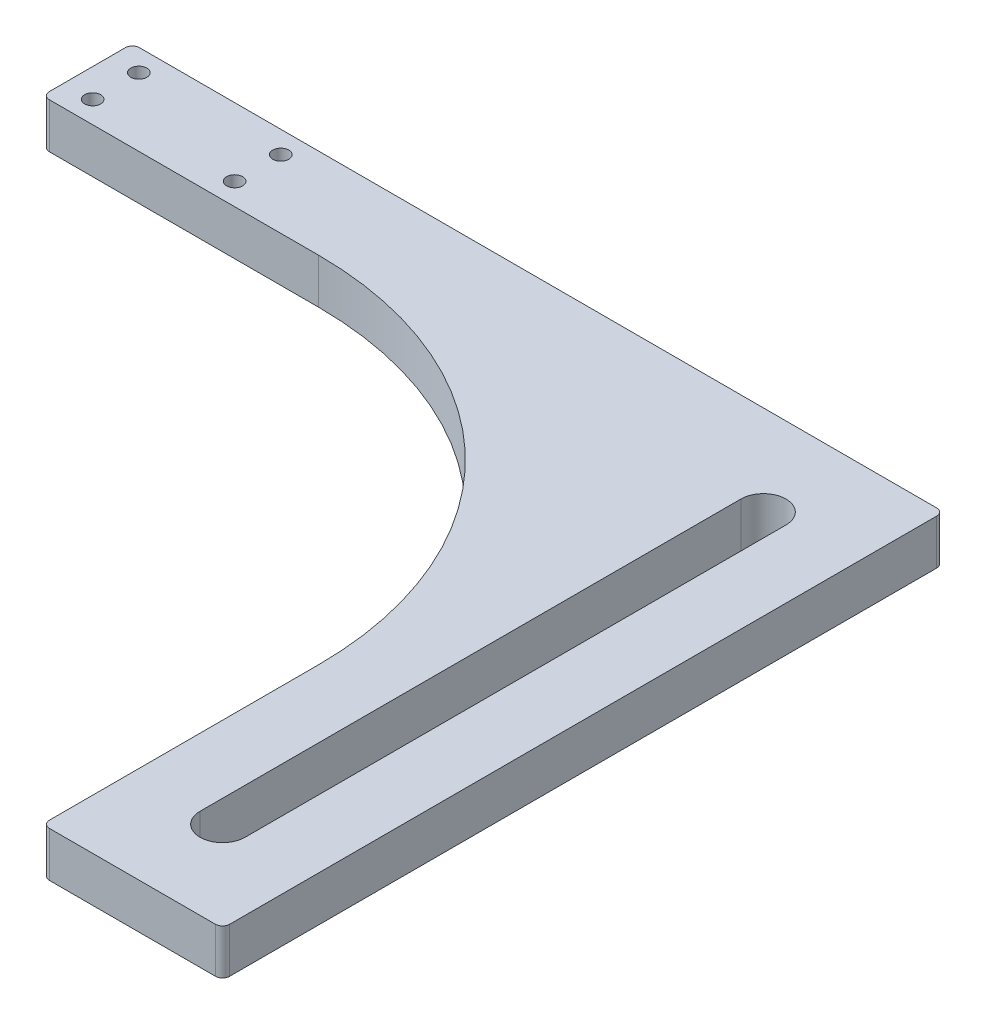
ISO-10303-21;
HEADER;
FILE_DESCRIPTION(('STEP AP214'),'2;1');
FILE_NAME('part.step','',(''),(''),'','','');
FILE_SCHEMA(('AUTOMOTIVE_DESIGN { 1 0 10303 214 1 1 1 1 }'));
ENDSEC;
DATA;
#1=APPLICATION_CONTEXT('core data for automotive mechanical design processes');
#2=APPLICATION_PROTOCOL_DEFINITION('international standard','automotive_design',2000,#1);
#3=PRODUCT_CONTEXT('',#1,'mechanical');
#4=PRODUCT('Part','Part','',(#3));
#5=PRODUCT_RELATED_PRODUCT_CATEGORY('part','',(#4));
#6=PRODUCT_DEFINITION_FORMATION('','',#4);
#7=PRODUCT_DEFINITION_CONTEXT('part definition',#1,'design');
#8=PRODUCT_DEFINITION('design','',#6,#7);
#9=PRODUCT_DEFINITION_SHAPE('','',#8);
#10=(LENGTH_UNIT() NAMED_UNIT(*) SI_UNIT(.MILLI.,.METRE.));
#11=(NAMED_UNIT(*) PLANE_ANGLE_UNIT() SI_UNIT($,.RADIAN.));
#12=(NAMED_UNIT(*) SI_UNIT($,.STERADIAN.) SOLID_ANGLE_UNIT());
#13=UNCERTAINTY_MEASURE_WITH_UNIT(LENGTH_MEASURE(1.E-05),#10,'distance_accuracy_value','');
#14=(GEOMETRIC_REPRESENTATION_CONTEXT(3) GLOBAL_UNCERTAINTY_ASSIGNED_CONTEXT((#13)) GLOBAL_UNIT_ASSIGNED_CONTEXT((#10,
#11,#12)) REPRESENTATION_CONTEXT('',''));
#15=CARTESIAN_POINT('',(0.,0.,0.));
#16=DIRECTION('',(0.,0.,1.));
#17=DIRECTION('',(1.,0.,0.));
#18=AXIS2_PLACEMENT_3D('',#15,#16,#17);
#19=CARTESIAN_POINT('',(-62.7,6.35,11.9));
#20=DIRECTION('',(0.,-1.,0.));
#21=DIRECTION('',(0.,0.,-1.));
#22=AXIS2_PLACEMENT_3D('',#19,#20,#21);
#23=PLANE('',#22);
#24=DIRECTION('',(-1.,0.,0.));
#25=VECTOR('',#24,1.);
#26=CARTESIAN_POINT('',(-12.7,6.35,-50.8));
#27=LINE('',#26,#25);
#28=CARTESIAN_POINT('',(11.7,6.35,-50.8));
#29=VERTEX_POINT('',#28);
#30=CARTESIAN_POINT('',(-100.6,6.35,-50.8));
#31=VERTEX_POINT('',#30);
#32=EDGE_CURVE('E196',#29,#31,#27,.T.);
#33=ORIENTED_EDGE('',*,*,#32,.T.);
#34=CARTESIAN_POINT('',(-100.6,6.35,-49.8));
#35=DIRECTION('',(0.,-1.,0.));
#36=DIRECTION('',(0.,0.,-1.));
#37=AXIS2_PLACEMENT_3D('',#34,#35,#36);
#38=CIRCLE('',#37,1.);
#39=CARTESIAN_POINT('',(-101.6,6.35,-49.8));
#40=VERTEX_POINT('',#39);
#41=EDGE_CURVE('E260',#31,#40,#38,.F.);
#42=ORIENTED_EDGE('',*,*,#41,.T.);
#43=DIRECTION('',(0.,0.,1.));
#44=VECTOR('',#43,1.);
#45=CARTESIAN_POINT('',(-101.6,6.35,-50.8));
#46=LINE('',#45,#44);
#47=CARTESIAN_POINT('',(-101.6,6.35,-39.1));
#48=VERTEX_POINT('',#47);
#49=EDGE_CURVE('E200',#40,#48,#46,.T.);
#50=ORIENTED_EDGE('',*,*,#49,.T.);
#51=CARTESIAN_POINT('',(-100.6,6.35,-39.1));
#52=DIRECTION('',(0.,-1.,0.));
#53=DIRECTION('',(0.,0.,-1.));
#54=AXIS2_PLACEMENT_3D('',#51,#52,#53);
#55=CIRCLE('',#54,1.);
#56=CARTESIAN_POINT('',(-100.6,6.35,-38.1));
#57=VERTEX_POINT('',#56);
#58=EDGE_CURVE('E258',#48,#57,#55,.F.);
#59=ORIENTED_EDGE('',*,*,#58,.T.);
#60=DIRECTION('',(1.,0.,0.));
#61=VECTOR('',#60,1.);
#62=CARTESIAN_POINT('',(-101.6,6.35,-38.1));
#63=LINE('',#62,#61);
#64=CARTESIAN_POINT('',(-62.7,6.35,-38.1));
#65=VERTEX_POINT('',#64);
#66=EDGE_CURVE('E203',#57,#65,#63,.T.);
#67=ORIENTED_EDGE('',*,*,#66,.T.);
#68=CARTESIAN_POINT('',(-62.7,6.35,11.9));
#69=DIRECTION('',(0.,-1.,0.));
#70=DIRECTION('',(0.,0.,-1.));
#71=AXIS2_PLACEMENT_3D('',#68,#69,#70);
#72=CIRCLE('',#71,50.);
#73=CARTESIAN_POINT('',(-12.7,6.35,11.9));
#74=VERTEX_POINT('',#73);
#75=EDGE_CURVE('E205',#65,#74,#72,.T.);
#76=ORIENTED_EDGE('',*,*,#75,.T.);
#77=DIRECTION('',(0.,0.,1.));
#78=VECTOR('',#77,1.);
#79=CARTESIAN_POINT('',(-12.7,6.35,11.9));
#80=LINE('',#79,#78);
#81=CARTESIAN_POINT('',(-12.7,6.35,49.8));
#82=VERTEX_POINT('',#81);
#83=EDGE_CURVE('E207',#74,#82,#80,.T.);
#84=ORIENTED_EDGE('',*,*,#83,.T.);
#85=CARTESIAN_POINT('',(-11.7,6.35,49.8));
#86=DIRECTION('',(0.,-1.,0.));
#87=DIRECTION('',(0.,0.,-1.));
#88=AXIS2_PLACEMENT_3D('',#85,#86,#87);
#89=CIRCLE('',#88,1.);
#90=CARTESIAN_POINT('',(-11.7,6.35,50.8));
#91=VERTEX_POINT('',#90);
#92=EDGE_CURVE('E55',#82,#91,#89,.F.);
#93=ORIENTED_EDGE('',*,*,#92,.T.);
#94=DIRECTION('',(1.,0.,0.));
#95=VECTOR('',#94,1.);
#96=CARTESIAN_POINT('',(-12.7,6.35,50.8));
#97=LINE('',#96,#95);
#98=CARTESIAN_POINT('',(11.7,6.35,50.8));
#99=VERTEX_POINT('',#98);
#100=EDGE_CURVE('E209',#91,#99,#97,.T.);
#101=ORIENTED_EDGE('',*,*,#100,.T.);
#102=CARTESIAN_POINT('',(11.7,6.35,49.8));
#103=DIRECTION('',(0.,-1.,0.));
#104=DIRECTION('',(0.,0.,-1.));
#105=AXIS2_PLACEMENT_3D('',#102,#103,#104);
#106=CIRCLE('',#105,1.);
#107=CARTESIAN_POINT('',(12.7,6.35,49.8));
#108=VERTEX_POINT('',#107);
#109=EDGE_CURVE('E255',#99,#108,#106,.F.);
#110=ORIENTED_EDGE('',*,*,#109,.T.);
#111=DIRECTION('',(0.,0.,-1.));
#112=VECTOR('',#111,1.);
#113=CARTESIAN_POINT('',(12.7,6.35,50.8));
#114=LINE('',#113,#112);
#115=CARTESIAN_POINT('',(12.7,6.35,-49.8));
#116=VERTEX_POINT('',#115);
#117=EDGE_CURVE('E193',#108,#116,#114,.T.);
#118=ORIENTED_EDGE('',*,*,#117,.T.);
#119=CARTESIAN_POINT('',(11.7,6.35,-49.8));
#120=DIRECTION('',(0.,-1.,0.));
#121=DIRECTION('',(0.,0.,-1.));
#122=AXIS2_PLACEMENT_3D('',#119,#120,#121);
#123=CIRCLE('',#122,1.);
#124=EDGE_CURVE('E253',#116,#29,#123,.F.);
#125=ORIENTED_EDGE('',*,*,#124,.T.);
#126=EDGE_LOOP('',(#33,#42,#50,#59,#67,#76,#84,#93,#101,#110,#118,#125));
#127=FACE_BOUND('',#126,.T.);
#128=CARTESIAN_POINT('',(0.,6.35,38.1));
#129=DIRECTION('',(0.,1.,0.));
#130=DIRECTION('',(0.,0.,1.));
#131=AXIS2_PLACEMENT_3D('',#128,#129,#130);
#132=CIRCLE('',#131,3.175);
#133=CARTESIAN_POINT('',(-3.175,6.35,38.1));
#134=VERTEX_POINT('',#133);
#135=CARTESIAN_POINT('',(3.175,6.35,38.1));
#136=VERTEX_POINT('',#135);
#137=EDGE_CURVE('E149',#134,#136,#132,.T.);
#138=ORIENTED_EDGE('',*,*,#137,.F.);
#139=DIRECTION('',(0.,0.,1.));
#140=VECTOR('',#139,1.);
#141=CARTESIAN_POINT('',(-3.175,6.35,38.1));
#142=LINE('',#141,#140);
#143=CARTESIAN_POINT('',(-3.175,6.35,-38.1));
#144=VERTEX_POINT('',#143);
#145=EDGE_CURVE('E175',#144,#134,#142,.T.);
#146=ORIENTED_EDGE('',*,*,#145,.F.);
#147=CARTESIAN_POINT('',(0.,6.35,-38.1));
#148=DIRECTION('',(0.,1.,0.));
#149=DIRECTION('',(0.,0.,1.));
#150=AXIS2_PLACEMENT_3D('',#147,#148,#149);
#151=CIRCLE('',#150,3.175);
#152=CARTESIAN_POINT('',(3.175,6.35,-38.1));
#153=VERTEX_POINT('',#152);
#154=EDGE_CURVE('E173',#153,#144,#151,.T.);
#155=ORIENTED_EDGE('',*,*,#154,.F.);
#156=DIRECTION('',(0.,0.,-1.));
#157=VECTOR('',#156,1.);
#158=CARTESIAN_POINT('',(3.175,6.35,38.1));
#159=LINE('',#158,#157);
#160=EDGE_CURVE('E159',#136,#153,#159,.T.);
#161=ORIENTED_EDGE('',*,*,#160,.F.);
#162=EDGE_LOOP('',(#138,#146,#155,#161));
#163=FACE_BOUND('',#162,.T.);
#164=CARTESIAN_POINT('',(-97.6,6.35,-47.7));
#165=DIRECTION('',(0.,1.,0.));
#166=DIRECTION('',(0.,0.,1.));
#167=AXIS2_PLACEMENT_3D('',#164,#165,#166);
#168=CIRCLE('',#167,1.1303);
#169=CARTESIAN_POINT('',(-97.6,6.35,-46.5697));
#170=VERTEX_POINT('',#169);
#171=EDGE_CURVE('E182',#170,#170,#168,.T.);
#172=ORIENTED_EDGE('',*,*,#171,.F.);
#173=EDGE_LOOP('',(#172));
#174=FACE_BOUND('',#173,.T.);
#175=CARTESIAN_POINT('',(-97.6,6.35,-41.2));
#176=DIRECTION('',(0.,1.,0.));
#177=DIRECTION('',(0.,0.,1.));
#178=AXIS2_PLACEMENT_3D('',#175,#176,#177);
#179=CIRCLE('',#178,1.1303);
#180=CARTESIAN_POINT('',(-97.6,6.35,-40.0697));
#181=VERTEX_POINT('',#180);
#182=EDGE_CURVE('E535',#181,#181,#179,.T.);
#183=ORIENTED_EDGE('',*,*,#182,.F.);
#184=EDGE_LOOP('',(#183));
#185=FACE_BOUND('',#184,.T.);
#186=CARTESIAN_POINT('',(-77.6,6.35,-47.7));
#187=DIRECTION('',(0.,1.,0.));
#188=DIRECTION('',(0.,0.,1.));
#189=AXIS2_PLACEMENT_3D('',#186,#187,#188);
#190=CIRCLE('',#189,1.1303);
#191=CARTESIAN_POINT('',(-77.6,6.35,-46.5697));
#192=VERTEX_POINT('',#191);
#193=EDGE_CURVE('E530',#192,#192,#190,.T.);
#194=ORIENTED_EDGE('',*,*,#193,.F.);
#195=EDGE_LOOP('',(#194));
#196=FACE_BOUND('',#195,.T.);
#197=CARTESIAN_POINT('',(-77.6,6.35,-41.2));
#198=DIRECTION('',(0.,1.,0.));
#199=DIRECTION('',(0.,0.,1.));
#200=AXIS2_PLACEMENT_3D('',#197,#198,#199);
#201=CIRCLE('',#200,1.1303);
#202=CARTESIAN_POINT('',(-77.6,6.35,-40.0697));
#203=VERTEX_POINT('',#202);
#204=EDGE_CURVE('E524',#203,#203,#201,.T.);
#205=ORIENTED_EDGE('',*,*,#204,.F.);
#206=EDGE_LOOP('',(#205));
#207=FACE_BOUND('',#206,.T.);
#208=ADVANCED_FACE('F33',(#127,#163,#174,#185,#196,#207),#23,.F.);
#209=CARTESIAN_POINT('',(-62.7,0.,11.9));
#210=DIRECTION('',(0.,-1.,0.));
#211=DIRECTION('',(0.,0.,-1.));
#212=AXIS2_PLACEMENT_3D('',#209,#210,#211);
#213=PLANE('',#212);
#214=CARTESIAN_POINT('',(-77.6,0.,-47.7));
#215=DIRECTION('',(0.,1.,0.));
#216=DIRECTION('',(0.,0.,1.));
#217=AXIS2_PLACEMENT_3D('',#214,#215,#216);
#218=CIRCLE('',#217,1.1303);
#219=CARTESIAN_POINT('',(-77.6,0.,-46.5697));
#220=VERTEX_POINT('',#219);
#221=EDGE_CURVE('E527',#220,#220,#218,.T.);
#222=ORIENTED_EDGE('',*,*,#221,.T.);
#223=EDGE_LOOP('',(#222));
#224=FACE_BOUND('',#223,.T.);
#225=CARTESIAN_POINT('',(-97.6,0.,-47.7));
#226=DIRECTION('',(0.,1.,0.));
#227=DIRECTION('',(0.,0.,1.));
#228=AXIS2_PLACEMENT_3D('',#225,#226,#227);
#229=CIRCLE('',#228,1.1303);
#230=CARTESIAN_POINT('',(-97.6,0.,-46.5697));
#231=VERTEX_POINT('',#230);
#232=EDGE_CURVE('E538',#231,#231,#229,.T.);
#233=ORIENTED_EDGE('',*,*,#232,.T.);
#234=EDGE_LOOP('',(#233));
#235=FACE_BOUND('',#234,.T.);
#236=DIRECTION('',(0.,0.,1.));
#237=VECTOR('',#236,1.);
#238=CARTESIAN_POINT('',(-101.6,0.,-50.8));
#239=LINE('',#238,#237);
#240=CARTESIAN_POINT('',(-101.6,0.,-49.8));
#241=VERTEX_POINT('',#240);
#242=CARTESIAN_POINT('',(-101.6,0.,-39.1));
#243=VERTEX_POINT('',#242);
#244=EDGE_CURVE('E217',#241,#243,#239,.T.);
#245=ORIENTED_EDGE('',*,*,#244,.F.);
#246=CARTESIAN_POINT('',(-100.6,0.,-49.8));
#247=DIRECTION('',(0.,-1.,0.));
#248=DIRECTION('',(0.,0.,-1.));
#249=AXIS2_PLACEMENT_3D('',#246,#247,#248);
#250=CIRCLE('',#249,1.);
#251=CARTESIAN_POINT('',(-100.6,0.,-50.8));
#252=VERTEX_POINT('',#251);
#253=EDGE_CURVE('E246',#241,#252,#250,.T.);
#254=ORIENTED_EDGE('',*,*,#253,.T.);
#255=DIRECTION('',(-1.,0.,0.));
#256=VECTOR('',#255,1.);
#257=CARTESIAN_POINT('',(-12.7,0.,-50.8));
#258=LINE('',#257,#256);
#259=CARTESIAN_POINT('',(11.7,0.,-50.8));
#260=VERTEX_POINT('',#259);
#261=EDGE_CURVE('E214',#260,#252,#258,.T.);
#262=ORIENTED_EDGE('',*,*,#261,.F.);
#263=CARTESIAN_POINT('',(11.7,0.,-49.8));
#264=DIRECTION('',(0.,-1.,0.));
#265=DIRECTION('',(0.,0.,-1.));
#266=AXIS2_PLACEMENT_3D('',#263,#264,#265);
#267=CIRCLE('',#266,1.);
#268=CARTESIAN_POINT('',(12.7,0.,-49.8));
#269=VERTEX_POINT('',#268);
#270=EDGE_CURVE('E238',#260,#269,#267,.T.);
#271=ORIENTED_EDGE('',*,*,#270,.T.);
#272=DIRECTION('',(0.,0.,-1.));
#273=VECTOR('',#272,1.);
#274=CARTESIAN_POINT('',(12.7,0.,50.8));
#275=LINE('',#274,#273);
#276=CARTESIAN_POINT('',(12.7,0.,49.8));
#277=VERTEX_POINT('',#276);
#278=EDGE_CURVE('E167',#277,#269,#275,.T.);
#279=ORIENTED_EDGE('',*,*,#278,.F.);
#280=CARTESIAN_POINT('',(11.7,0.,49.8));
#281=DIRECTION('',(0.,-1.,0.));
#282=DIRECTION('',(0.,0.,-1.));
#283=AXIS2_PLACEMENT_3D('',#280,#281,#282);
#284=CIRCLE('',#283,1.);
#285=CARTESIAN_POINT('',(11.7,0.,50.8));
#286=VERTEX_POINT('',#285);
#287=EDGE_CURVE('E240',#277,#286,#284,.T.);
#288=ORIENTED_EDGE('',*,*,#287,.T.);
#289=DIRECTION('',(1.,0.,0.));
#290=VECTOR('',#289,1.);
#291=CARTESIAN_POINT('',(-12.7,0.,50.8));
#292=LINE('',#291,#290);
#293=CARTESIAN_POINT('',(-11.7,0.,50.8));
#294=VERTEX_POINT('',#293);
#295=EDGE_CURVE('E197',#294,#286,#292,.T.);
#296=ORIENTED_EDGE('',*,*,#295,.F.);
#297=CARTESIAN_POINT('',(-11.7,0.,49.8));
#298=DIRECTION('',(0.,-1.,0.));
#299=DIRECTION('',(0.,0.,-1.));
#300=AXIS2_PLACEMENT_3D('',#297,#298,#299);
#301=CIRCLE('',#300,1.);
#302=CARTESIAN_POINT('',(-12.7,0.,49.8));
#303=VERTEX_POINT('',#302);
#304=EDGE_CURVE('E242',#294,#303,#301,.T.);
#305=ORIENTED_EDGE('',*,*,#304,.T.);
#306=DIRECTION('',(0.,0.,1.));
#307=VECTOR('',#306,1.);
#308=CARTESIAN_POINT('',(-12.7,0.,11.9));
#309=LINE('',#308,#307);
#310=CARTESIAN_POINT('',(-12.7,0.,11.9));
#311=VERTEX_POINT('',#310);
#312=EDGE_CURVE('E224',#311,#303,#309,.T.);
#313=ORIENTED_EDGE('',*,*,#312,.F.);
#314=CARTESIAN_POINT('',(-62.7,0.,11.9));
#315=DIRECTION('',(0.,-1.,0.));
#316=DIRECTION('',(0.,0.,-1.));
#317=AXIS2_PLACEMENT_3D('',#314,#315,#316);
#318=CIRCLE('',#317,50.);
#319=CARTESIAN_POINT('',(-62.7,0.,-38.1));
#320=VERTEX_POINT('',#319);
#321=EDGE_CURVE('E222',#320,#311,#318,.T.);
#322=ORIENTED_EDGE('',*,*,#321,.F.);
#323=DIRECTION('',(1.,0.,0.));
#324=VECTOR('',#323,1.);
#325=CARTESIAN_POINT('',(-101.6,0.,-38.1));
#326=LINE('',#325,#324);
#327=CARTESIAN_POINT('',(-100.6,0.,-38.1));
#328=VERTEX_POINT('',#327);
#329=EDGE_CURVE('E220',#328,#320,#326,.T.);
#330=ORIENTED_EDGE('',*,*,#329,.F.);
#331=CARTESIAN_POINT('',(-100.6,0.,-39.1));
#332=DIRECTION('',(0.,-1.,0.));
#333=DIRECTION('',(0.,0.,-1.));
#334=AXIS2_PLACEMENT_3D('',#331,#332,#333);
#335=CIRCLE('',#334,1.);
#336=EDGE_CURVE('E244',#328,#243,#335,.T.);
#337=ORIENTED_EDGE('',*,*,#336,.T.);
#338=EDGE_LOOP('',(#245,#254,#262,#271,#279,#288,#296,#305,#313,#322,#330,#337));
#339=FACE_BOUND('',#338,.T.);
#340=DIRECTION('',(0.,0.,1.));
#341=VECTOR('',#340,1.);
#342=CARTESIAN_POINT('',(-3.175,0.,38.1));
#343=LINE('',#342,#341);
#344=CARTESIAN_POINT('',(-3.175,0.,-38.1));
#345=VERTEX_POINT('',#344);
#346=CARTESIAN_POINT('',(-3.175,0.,38.1));
#347=VERTEX_POINT('',#346);
#348=EDGE_CURVE('E160',#345,#347,#343,.T.);
#349=ORIENTED_EDGE('',*,*,#348,.T.);
#350=CARTESIAN_POINT('',(0.,0.,38.1));
#351=DIRECTION('',(0.,1.,0.));
#352=DIRECTION('',(0.,0.,1.));
#353=AXIS2_PLACEMENT_3D('',#350,#351,#352);
#354=CIRCLE('',#353,3.175);
#355=CARTESIAN_POINT('',(3.175,0.,38.1));
#356=VERTEX_POINT('',#355);
#357=EDGE_CURVE('E180',#347,#356,#354,.T.);
#358=ORIENTED_EDGE('',*,*,#357,.T.);
#359=DIRECTION('',(0.,0.,-1.));
#360=VECTOR('',#359,1.);
#361=CARTESIAN_POINT('',(3.175,0.,38.1));
#362=LINE('',#361,#360);
#363=CARTESIAN_POINT('',(3.175,0.,-38.1));
#364=VERTEX_POINT('',#363);
#365=EDGE_CURVE('E166',#356,#364,#362,.T.);
#366=ORIENTED_EDGE('',*,*,#365,.T.);
#367=CARTESIAN_POINT('',(0.,0.,-38.1));
#368=DIRECTION('',(0.,1.,0.));
#369=DIRECTION('',(0.,0.,1.));
#370=AXIS2_PLACEMENT_3D('',#367,#368,#369);
#371=CIRCLE('',#370,3.175);
#372=EDGE_CURVE('E184',#364,#345,#371,.T.);
#373=ORIENTED_EDGE('',*,*,#372,.T.);
#374=EDGE_LOOP('',(#349,#358,#366,#373));
#375=FACE_BOUND('',#374,.T.);
#376=CARTESIAN_POINT('',(-97.6,0.,-41.2));
#377=DIRECTION('',(0.,1.,0.));
#378=DIRECTION('',(0.,0.,1.));
#379=AXIS2_PLACEMENT_3D('',#376,#377,#378);
#380=CIRCLE('',#379,1.1303);
#381=CARTESIAN_POINT('',(-97.6,0.,-40.0697));
#382=VERTEX_POINT('',#381);
#383=EDGE_CURVE('E519',#382,#382,#380,.T.);
#384=ORIENTED_EDGE('',*,*,#383,.T.);
#385=EDGE_LOOP('',(#384));
#386=FACE_BOUND('',#385,.T.);
#387=CARTESIAN_POINT('',(-77.6,0.,-41.2));
#388=DIRECTION('',(0.,1.,0.));
#389=DIRECTION('',(0.,0.,1.));
#390=AXIS2_PLACEMENT_3D('',#387,#388,#389);
#391=CIRCLE('',#390,1.1303);
#392=CARTESIAN_POINT('',(-77.6,0.,-40.0697));
#393=VERTEX_POINT('',#392);
#394=EDGE_CURVE('E522',#393,#393,#391,.T.);
#395=ORIENTED_EDGE('',*,*,#394,.T.);
#396=EDGE_LOOP('',(#395));
#397=FACE_BOUND('',#396,.T.);
#398=ADVANCED_FACE('F287',(#224,#235,#339,#375,#386,#397),#213,.T.);
#399=CARTESIAN_POINT('',(12.7,6.35,50.8));
#400=DIRECTION('',(-1.,0.,0.));
#401=DIRECTION('',(0.,0.,1.));
#402=AXIS2_PLACEMENT_3D('',#399,#400,#401);
#403=PLANE('',#402);
#404=ORIENTED_EDGE('',*,*,#117,.F.);
#405=DIRECTION('',(0.,-1.,0.));
#406=VECTOR('',#405,1.);
#407=CARTESIAN_POINT('',(12.7,6.35,49.8));
#408=LINE('',#407,#406);
#409=EDGE_CURVE('E11',#108,#277,#408,.T.);
#410=ORIENTED_EDGE('',*,*,#409,.T.);
#411=ORIENTED_EDGE('',*,*,#278,.T.);
#412=DIRECTION('',(0.,-1.,0.));
#413=VECTOR('',#412,1.);
#414=CARTESIAN_POINT('',(12.7,6.35,-49.8));
#415=LINE('',#414,#413);
#416=EDGE_CURVE('E41',#269,#116,#415,.F.);
#417=ORIENTED_EDGE('',*,*,#416,.T.);
#418=EDGE_LOOP('',(#404,#410,#411,#417));
#419=FACE_BOUND('',#418,.T.);
#420=ADVANCED_FACE('F273',(#419),#403,.F.);
#421=CARTESIAN_POINT('',(-12.7,6.35,-50.8));
#422=DIRECTION('',(0.,0.,1.));
#423=DIRECTION('',(1.,0.,0.));
#424=AXIS2_PLACEMENT_3D('',#421,#422,#423);
#425=PLANE('',#424);
#426=ORIENTED_EDGE('',*,*,#261,.T.);
#427=DIRECTION('',(0.,-1.,0.));
#428=VECTOR('',#427,1.);
#429=CARTESIAN_POINT('',(-100.6,6.35,-50.8));
#430=LINE('',#429,#428);
#431=EDGE_CURVE('E251',#252,#31,#430,.F.);
#432=ORIENTED_EDGE('',*,*,#431,.T.);
#433=ORIENTED_EDGE('',*,*,#32,.F.);
#434=DIRECTION('',(0.,-1.,0.));
#435=VECTOR('',#434,1.);
#436=CARTESIAN_POINT('',(11.7,6.35,-50.8));
#437=LINE('',#436,#435);
#438=EDGE_CURVE('E248',#29,#260,#437,.T.);
#439=ORIENTED_EDGE('',*,*,#438,.T.);
#440=EDGE_LOOP('',(#426,#432,#433,#439));
#441=FACE_BOUND('',#440,.T.);
#442=ADVANCED_FACE('F283',(#441),#425,.F.);
#443=CARTESIAN_POINT('',(-101.6,6.35,-50.8));
#444=DIRECTION('',(1.,0.,0.));
#445=DIRECTION('',(0.,0.,-1.));
#446=AXIS2_PLACEMENT_3D('',#443,#444,#445);
#447=PLANE('',#446);
#448=ORIENTED_EDGE('',*,*,#49,.F.);
#449=DIRECTION('',(0.,-1.,0.));
#450=VECTOR('',#449,1.);
#451=CARTESIAN_POINT('',(-101.6,6.35,-49.8));
#452=LINE('',#451,#450);
#453=EDGE_CURVE('E235',#40,#241,#452,.T.);
#454=ORIENTED_EDGE('',*,*,#453,.T.);
#455=ORIENTED_EDGE('',*,*,#244,.T.);
#456=DIRECTION('',(0.,-1.,0.));
#457=VECTOR('',#456,1.);
#458=CARTESIAN_POINT('',(-101.6,6.35,-39.1));
#459=LINE('',#458,#457);
#460=EDGE_CURVE('E233',#243,#48,#459,.F.);
#461=ORIENTED_EDGE('',*,*,#460,.T.);
#462=EDGE_LOOP('',(#448,#454,#455,#461));
#463=FACE_BOUND('',#462,.T.);
#464=ADVANCED_FACE('F295',(#463),#447,.F.);
#465=CARTESIAN_POINT('',(-101.6,6.35,-38.1));
#466=DIRECTION('',(0.,0.,-1.));
#467=DIRECTION('',(-1.,0.,0.));
#468=AXIS2_PLACEMENT_3D('',#465,#466,#467);
#469=PLANE('',#468);
#470=ORIENTED_EDGE('',*,*,#66,.F.);
#471=DIRECTION('',(0.,-1.,0.));
#472=VECTOR('',#471,1.);
#473=CARTESIAN_POINT('',(-100.6,6.35,-38.1));
#474=LINE('',#473,#472);
#475=EDGE_CURVE('E262',#57,#328,#474,.T.);
#476=ORIENTED_EDGE('',*,*,#475,.T.);
#477=ORIENTED_EDGE('',*,*,#329,.T.);
#478=DIRECTION('',(0.,-1.,0.));
#479=VECTOR('',#478,1.);
#480=CARTESIAN_POINT('',(-62.7,6.35,-38.1));
#481=LINE('',#480,#479);
#482=EDGE_CURVE('E230',#65,#320,#481,.T.);
#483=ORIENTED_EDGE('',*,*,#482,.F.);
#484=EDGE_LOOP('',(#470,#476,#477,#483));
#485=FACE_BOUND('',#484,.T.);
#486=ADVANCED_FACE('F304',(#485),#469,.F.);
#487=CARTESIAN_POINT('',(-62.7,6.35,11.9));
#488=DIRECTION('',(0.,-1.,0.));
#489=DIRECTION('',(0.,0.,-1.));
#490=AXIS2_PLACEMENT_3D('',#487,#488,#489);
#491=CYLINDRICAL_SURFACE('',#490,50.);
#492=ORIENTED_EDGE('',*,*,#321,.T.);
#493=DIRECTION('',(0.,-1.,0.));
#494=VECTOR('',#493,1.);
#495=CARTESIAN_POINT('',(-12.7,6.35,11.9));
#496=LINE('',#495,#494);
#497=EDGE_CURVE('E211',#74,#311,#496,.T.);
#498=ORIENTED_EDGE('',*,*,#497,.F.);
#499=ORIENTED_EDGE('',*,*,#75,.F.);
#500=ORIENTED_EDGE('',*,*,#482,.T.);
#501=EDGE_LOOP('',(#492,#498,#499,#500));
#502=FACE_BOUND('',#501,.T.);
#503=ADVANCED_FACE('F310',(#502),#491,.F.);
#504=CARTESIAN_POINT('',(-12.7,6.35,11.9));
#505=DIRECTION('',(1.,0.,0.));
#506=DIRECTION('',(0.,0.,-1.));
#507=AXIS2_PLACEMENT_3D('',#504,#505,#506);
#508=PLANE('',#507);
#509=ORIENTED_EDGE('',*,*,#312,.T.);
#510=DIRECTION('',(0.,-1.,0.));
#511=VECTOR('',#510,1.);
#512=CARTESIAN_POINT('',(-12.7,6.35,49.8));
#513=LINE('',#512,#511);
#514=EDGE_CURVE('E269',#303,#82,#513,.F.);
#515=ORIENTED_EDGE('',*,*,#514,.T.);
#516=ORIENTED_EDGE('',*,*,#83,.F.);
#517=ORIENTED_EDGE('',*,*,#497,.T.);
#518=EDGE_LOOP('',(#509,#515,#516,#517));
#519=FACE_BOUND('',#518,.T.);
#520=ADVANCED_FACE('F314',(#519),#508,.F.);
#521=CARTESIAN_POINT('',(-12.7,6.35,50.8));
#522=DIRECTION('',(0.,0.,-1.));
#523=DIRECTION('',(-1.,0.,0.));
#524=AXIS2_PLACEMENT_3D('',#521,#522,#523);
#525=PLANE('',#524);
#526=ORIENTED_EDGE('',*,*,#100,.F.);
#527=DIRECTION('',(0.,-1.,0.));
#528=VECTOR('',#527,1.);
#529=CARTESIAN_POINT('',(-11.7,6.35,50.8));
#530=LINE('',#529,#528);
#531=EDGE_CURVE('E266',#91,#294,#530,.T.);
#532=ORIENTED_EDGE('',*,*,#531,.T.);
#533=ORIENTED_EDGE('',*,*,#295,.T.);
#534=DIRECTION('',(0.,-1.,0.));
#535=VECTOR('',#534,1.);
#536=CARTESIAN_POINT('',(11.7,6.35,50.8));
#537=LINE('',#536,#535);
#538=EDGE_CURVE('E48',#286,#99,#537,.F.);
#539=ORIENTED_EDGE('',*,*,#538,.T.);
#540=EDGE_LOOP('',(#526,#532,#533,#539));
#541=FACE_BOUND('',#540,.T.);
#542=ADVANCED_FACE('F320',(#541),#525,.F.);
#543=CARTESIAN_POINT('',(0.,6.35,38.1));
#544=DIRECTION('',(0.,-1.,0.));
#545=DIRECTION('',(0.,0.,-1.));
#546=AXIS2_PLACEMENT_3D('',#543,#544,#545);
#547=CYLINDRICAL_SURFACE('',#546,3.175);
#548=ORIENTED_EDGE('',*,*,#357,.F.);
#549=DIRECTION('',(0.,-1.,0.));
#550=VECTOR('',#549,1.);
#551=CARTESIAN_POINT('',(-3.175,6.35,38.1));
#552=LINE('',#551,#550);
#553=EDGE_CURVE('E155',#134,#347,#552,.T.);
#554=ORIENTED_EDGE('',*,*,#553,.F.);
#555=ORIENTED_EDGE('',*,*,#137,.T.);
#556=DIRECTION('',(0.,-1.,0.));
#557=VECTOR('',#556,1.);
#558=CARTESIAN_POINT('',(3.175,6.35,38.1));
#559=LINE('',#558,#557);
#560=EDGE_CURVE('E152',#136,#356,#559,.T.);
#561=ORIENTED_EDGE('',*,*,#560,.T.);
#562=EDGE_LOOP('',(#548,#554,#555,#561));
#563=FACE_BOUND('',#562,.T.);
#564=ADVANCED_FACE('F151',(#563),#547,.F.);
#565=CARTESIAN_POINT('',(3.175,6.35,38.1));
#566=DIRECTION('',(-1.,0.,0.));
#567=DIRECTION('',(0.,0.,1.));
#568=AXIS2_PLACEMENT_3D('',#565,#566,#567);
#569=PLANE('',#568);
#570=ORIENTED_EDGE('',*,*,#365,.F.);
#571=ORIENTED_EDGE('',*,*,#560,.F.);
#572=ORIENTED_EDGE('',*,*,#160,.T.);
#573=DIRECTION('',(0.,-1.,0.));
#574=VECTOR('',#573,1.);
#575=CARTESIAN_POINT('',(3.175,6.35,-38.1));
#576=LINE('',#575,#574);
#577=EDGE_CURVE('E168',#153,#364,#576,.T.);
#578=ORIENTED_EDGE('',*,*,#577,.T.);
#579=EDGE_LOOP('',(#570,#571,#572,#578));
#580=FACE_BOUND('',#579,.T.);
#581=ADVANCED_FACE('F163',(#580),#569,.T.);
#582=CARTESIAN_POINT('',(0.,6.35,-38.1));
#583=DIRECTION('',(0.,-1.,0.));
#584=DIRECTION('',(0.,0.,-1.));
#585=AXIS2_PLACEMENT_3D('',#582,#583,#584);
#586=CYLINDRICAL_SURFACE('',#585,3.175);
#587=ORIENTED_EDGE('',*,*,#372,.F.);
#588=ORIENTED_EDGE('',*,*,#577,.F.);
#589=ORIENTED_EDGE('',*,*,#154,.T.);
#590=DIRECTION('',(0.,-1.,0.));
#591=VECTOR('',#590,1.);
#592=CARTESIAN_POINT('',(-3.175,6.35,-38.1));
#593=LINE('',#592,#591);
#594=EDGE_CURVE('E190',#144,#345,#593,.T.);
#595=ORIENTED_EDGE('',*,*,#594,.T.);
#596=EDGE_LOOP('',(#587,#588,#589,#595));
#597=FACE_BOUND('',#596,.T.);
#598=ADVANCED_FACE('F428',(#597),#586,.F.);
#599=CARTESIAN_POINT('',(-3.175,6.35,38.1));
#600=DIRECTION('',(1.,0.,0.));
#601=DIRECTION('',(0.,0.,-1.));
#602=AXIS2_PLACEMENT_3D('',#599,#600,#601);
#603=PLANE('',#602);
#604=ORIENTED_EDGE('',*,*,#348,.F.);
#605=ORIENTED_EDGE('',*,*,#594,.F.);
#606=ORIENTED_EDGE('',*,*,#145,.T.);
#607=ORIENTED_EDGE('',*,*,#553,.T.);
#608=EDGE_LOOP('',(#604,#605,#606,#607));
#609=FACE_BOUND('',#608,.T.);
#610=ADVANCED_FACE('F419',(#609),#603,.T.);
#611=CARTESIAN_POINT('',(-97.6,6.35,-47.7));
#612=DIRECTION('',(0.,-1.,0.));
#613=DIRECTION('',(0.,0.,-1.));
#614=AXIS2_PLACEMENT_3D('',#611,#612,#613);
#615=CYLINDRICAL_SURFACE('',#614,1.1303);
#616=ORIENTED_EDGE('',*,*,#171,.T.);
#617=EDGE_LOOP('',(#616));
#618=FACE_BOUND('',#617,.T.);
#619=ORIENTED_EDGE('',*,*,#232,.F.);
#620=EDGE_LOOP('',(#619));
#621=FACE_BOUND('',#620,.T.);
#622=ADVANCED_FACE('F410',(#618,#621),#615,.F.);
#623=CARTESIAN_POINT('',(-97.6,6.35,-41.2));
#624=DIRECTION('',(0.,-1.,0.));
#625=DIRECTION('',(0.,0.,-1.));
#626=AXIS2_PLACEMENT_3D('',#623,#624,#625);
#627=CYLINDRICAL_SURFACE('',#626,1.1303);
#628=ORIENTED_EDGE('',*,*,#182,.T.);
#629=EDGE_LOOP('',(#628));
#630=FACE_BOUND('',#629,.T.);
#631=ORIENTED_EDGE('',*,*,#383,.F.);
#632=EDGE_LOOP('',(#631));
#633=FACE_BOUND('',#632,.T.);
#634=ADVANCED_FACE('F401',(#630,#633),#627,.F.);
#635=CARTESIAN_POINT('',(-77.6,6.35,-47.7));
#636=DIRECTION('',(0.,-1.,0.));
#637=DIRECTION('',(0.,0.,-1.));
#638=AXIS2_PLACEMENT_3D('',#635,#636,#637);
#639=CYLINDRICAL_SURFACE('',#638,1.1303);
#640=ORIENTED_EDGE('',*,*,#193,.T.);
#641=EDGE_LOOP('',(#640));
#642=FACE_BOUND('',#641,.T.);
#643=ORIENTED_EDGE('',*,*,#221,.F.);
#644=EDGE_LOOP('',(#643));
#645=FACE_BOUND('',#644,.T.);
#646=ADVANCED_FACE('F392',(#642,#645),#639,.F.);
#647=CARTESIAN_POINT('',(-77.6,6.35,-41.2));
#648=DIRECTION('',(0.,-1.,0.));
#649=DIRECTION('',(0.,0.,-1.));
#650=AXIS2_PLACEMENT_3D('',#647,#648,#649);
#651=CYLINDRICAL_SURFACE('',#650,1.1303);
#652=ORIENTED_EDGE('',*,*,#204,.T.);
#653=EDGE_LOOP('',(#652));
#654=FACE_BOUND('',#653,.T.);
#655=ORIENTED_EDGE('',*,*,#394,.F.);
#656=EDGE_LOOP('',(#655));
#657=FACE_BOUND('',#656,.T.);
#658=ADVANCED_FACE('F355',(#654,#657),#651,.F.);
#659=CARTESIAN_POINT('',(-100.6,6.35,-49.8));
#660=DIRECTION('',(0.,-1.,0.));
#661=DIRECTION('',(0.,0.,-1.));
#662=AXIS2_PLACEMENT_3D('',#659,#660,#661);
#663=CYLINDRICAL_SURFACE('',#662,1.);
#664=ORIENTED_EDGE('',*,*,#41,.F.);
#665=ORIENTED_EDGE('',*,*,#431,.F.);
#666=ORIENTED_EDGE('',*,*,#253,.F.);
#667=ORIENTED_EDGE('',*,*,#453,.F.);
#668=EDGE_LOOP('',(#664,#665,#666,#667));
#669=FACE_BOUND('',#668,.T.);
#670=ADVANCED_FACE('F292',(#669),#663,.T.);
#671=CARTESIAN_POINT('',(-100.6,6.35,-39.1));
#672=DIRECTION('',(0.,-1.,0.));
#673=DIRECTION('',(0.,0.,-1.));
#674=AXIS2_PLACEMENT_3D('',#671,#672,#673);
#675=CYLINDRICAL_SURFACE('',#674,1.);
#676=ORIENTED_EDGE('',*,*,#58,.F.);
#677=ORIENTED_EDGE('',*,*,#460,.F.);
#678=ORIENTED_EDGE('',*,*,#336,.F.);
#679=ORIENTED_EDGE('',*,*,#475,.F.);
#680=EDGE_LOOP('',(#676,#677,#678,#679));
#681=FACE_BOUND('',#680,.T.);
#682=ADVANCED_FACE('F301',(#681),#675,.T.);
#683=CARTESIAN_POINT('',(-11.7,6.35,49.8));
#684=DIRECTION('',(0.,-1.,0.));
#685=DIRECTION('',(0.,0.,-1.));
#686=AXIS2_PLACEMENT_3D('',#683,#684,#685);
#687=CYLINDRICAL_SURFACE('',#686,1.);
#688=ORIENTED_EDGE('',*,*,#92,.F.);
#689=ORIENTED_EDGE('',*,*,#514,.F.);
#690=ORIENTED_EDGE('',*,*,#304,.F.);
#691=ORIENTED_EDGE('',*,*,#531,.F.);
#692=EDGE_LOOP('',(#688,#689,#690,#691));
#693=FACE_BOUND('',#692,.T.);
#694=ADVANCED_FACE('F318',(#693),#687,.T.);
#695=CARTESIAN_POINT('',(11.7,6.35,49.8));
#696=DIRECTION('',(0.,-1.,0.));
#697=DIRECTION('',(0.,0.,-1.));
#698=AXIS2_PLACEMENT_3D('',#695,#696,#697);
#699=CYLINDRICAL_SURFACE('',#698,1.);
#700=ORIENTED_EDGE('',*,*,#109,.F.);
#701=ORIENTED_EDGE('',*,*,#538,.F.);
#702=ORIENTED_EDGE('',*,*,#287,.F.);
#703=ORIENTED_EDGE('',*,*,#409,.F.);
#704=EDGE_LOOP('',(#700,#701,#702,#703));
#705=FACE_BOUND('',#704,.T.);
#706=ADVANCED_FACE('F322',(#705),#699,.T.);
#707=CARTESIAN_POINT('',(11.7,6.35,-49.8));
#708=DIRECTION('',(0.,-1.,0.));
#709=DIRECTION('',(0.,0.,-1.));
#710=AXIS2_PLACEMENT_3D('',#707,#708,#709);
#711=CYLINDRICAL_SURFACE('',#710,1.);
#712=ORIENTED_EDGE('',*,*,#124,.F.);
#713=ORIENTED_EDGE('',*,*,#416,.F.);
#714=ORIENTED_EDGE('',*,*,#270,.F.);
#715=ORIENTED_EDGE('',*,*,#438,.F.);
#716=EDGE_LOOP('',(#712,#713,#714,#715));
#717=FACE_BOUND('',#716,.T.);
#718=ADVANCED_FACE('F35',(#717),#711,.T.);
#719=CLOSED_SHELL('',(#208,#398,#420,#442,#464,#486,#503,#520,#542,#564,#581,#598,#610,#622,
#634,#646,#658,#670,#682,#694,#706,#718));
#720=MANIFOLD_SOLID_BREP('B2',#719);
#721=ADVANCED_BREP_SHAPE_REPRESENTATION('',(#18,#720),#14);
#722=SHAPE_DEFINITION_REPRESENTATION(#9,#721);
ENDSEC;
END-ISO-10303-21;
